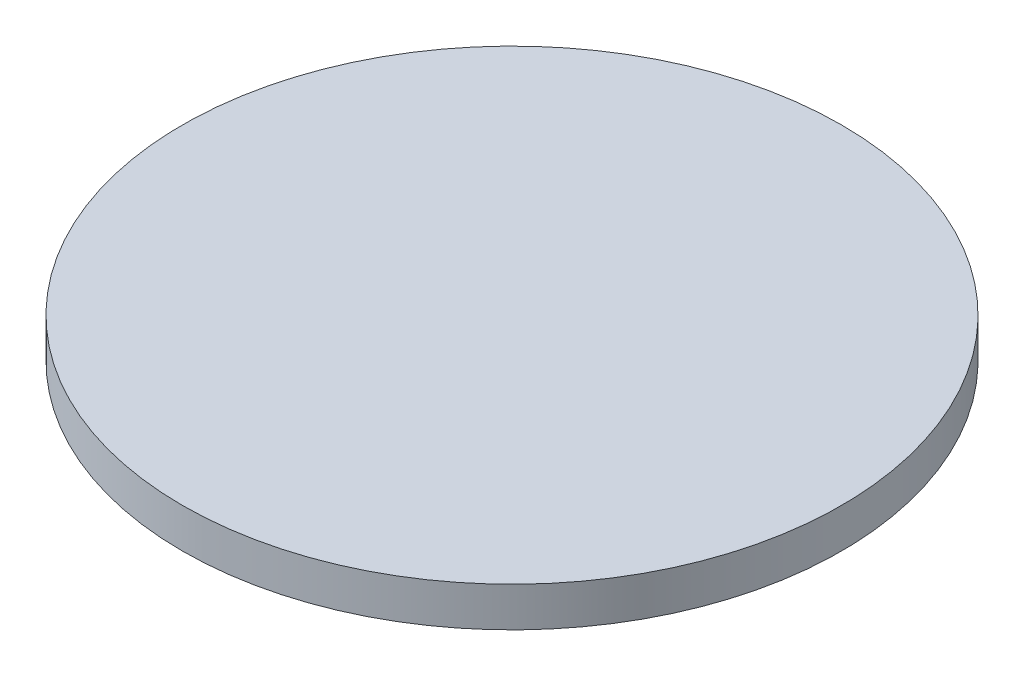
ISO-10303-21;
HEADER;
FILE_DESCRIPTION(('STEP AP214'),'2;1');
FILE_NAME('part.step','',(''),(''),'','','');
FILE_SCHEMA(('AUTOMOTIVE_DESIGN { 1 0 10303 214 1 1 1 1 }'));
ENDSEC;
DATA;
#1=APPLICATION_CONTEXT('core data for automotive mechanical design processes');
#2=APPLICATION_PROTOCOL_DEFINITION('international standard','automotive_design',2000,#1);
#3=PRODUCT_CONTEXT('',#1,'mechanical');
#4=PRODUCT('Part','Part','',(#3));
#5=PRODUCT_RELATED_PRODUCT_CATEGORY('part','',(#4));
#6=PRODUCT_DEFINITION_FORMATION('','',#4);
#7=PRODUCT_DEFINITION_CONTEXT('part definition',#1,'design');
#8=PRODUCT_DEFINITION('design','',#6,#7);
#9=PRODUCT_DEFINITION_SHAPE('','',#8);
#10=(LENGTH_UNIT() NAMED_UNIT(*) SI_UNIT(.MILLI.,.METRE.));
#11=(NAMED_UNIT(*) PLANE_ANGLE_UNIT() SI_UNIT($,.RADIAN.));
#12=(NAMED_UNIT(*) SI_UNIT($,.STERADIAN.) SOLID_ANGLE_UNIT());
#13=UNCERTAINTY_MEASURE_WITH_UNIT(LENGTH_MEASURE(1.E-05),#10,'distance_accuracy_value','');
#14=(GEOMETRIC_REPRESENTATION_CONTEXT(3) GLOBAL_UNCERTAINTY_ASSIGNED_CONTEXT((#13)) GLOBAL_UNIT_ASSIGNED_CONTEXT((#10,
#11,#12)) REPRESENTATION_CONTEXT('',''));
#15=CARTESIAN_POINT('',(0.,0.,0.));
#16=DIRECTION('',(0.,0.,1.));
#17=DIRECTION('',(1.,0.,0.));
#18=AXIS2_PLACEMENT_3D('',#15,#16,#17);
#19=CARTESIAN_POINT('',(0.,3.,0.));
#20=DIRECTION('',(0.,-1.,0.));
#21=DIRECTION('',(0.,0.,-1.));
#22=AXIS2_PLACEMENT_3D('',#19,#20,#21);
#23=CYLINDRICAL_SURFACE('',#22,25.);
#24=CARTESIAN_POINT('',(0.,3.,0.));
#25=DIRECTION('',(0.,1.,0.));
#26=DIRECTION('',(0.,0.,1.));
#27=AXIS2_PLACEMENT_3D('',#24,#25,#26);
#28=CIRCLE('',#27,25.);
#29=CARTESIAN_POINT('',(0.,3.,25.));
#30=VERTEX_POINT('',#29);
#31=EDGE_CURVE('E10',#30,#30,#28,.T.);
#32=ORIENTED_EDGE('',*,*,#31,.F.);
#33=EDGE_LOOP('',(#32));
#34=FACE_BOUND('',#33,.T.);
#35=CARTESIAN_POINT('',(0.,0.,0.));
#36=DIRECTION('',(0.,1.,0.));
#37=DIRECTION('',(0.,0.,1.));
#38=AXIS2_PLACEMENT_3D('',#35,#36,#37);
#39=CIRCLE('',#38,25.);
#40=CARTESIAN_POINT('',(0.,0.,25.));
#41=VERTEX_POINT('',#40);
#42=EDGE_CURVE('E34',#41,#41,#39,.T.);
#43=ORIENTED_EDGE('',*,*,#42,.T.);
#44=EDGE_LOOP('',(#43));
#45=FACE_BOUND('',#44,.T.);
#46=ADVANCED_FACE('F31',(#34,#45),#23,.T.);
#47=CARTESIAN_POINT('',(0.,3.,0.));
#48=DIRECTION('',(0.,1.,0.));
#49=DIRECTION('',(0.,0.,1.));
#50=AXIS2_PLACEMENT_3D('',#47,#48,#49);
#51=PLANE('',#50);
#52=ORIENTED_EDGE('',*,*,#31,.T.);
#53=EDGE_LOOP('',(#52));
#54=FACE_BOUND('',#53,.T.);
#55=ADVANCED_FACE('F46',(#54),#51,.T.);
#56=CARTESIAN_POINT('',(0.,0.,0.));
#57=DIRECTION('',(0.,1.,0.));
#58=DIRECTION('',(0.,0.,1.));
#59=AXIS2_PLACEMENT_3D('',#56,#57,#58);
#60=PLANE('',#59);
#61=ORIENTED_EDGE('',*,*,#42,.F.);
#62=EDGE_LOOP('',(#61));
#63=FACE_BOUND('',#62,.T.);
#64=ADVANCED_FACE('F44',(#63),#60,.F.);
#65=CLOSED_SHELL('',(#46,#55,#64));
#66=MANIFOLD_SOLID_BREP('B2',#65);
#67=ADVANCED_BREP_SHAPE_REPRESENTATION('',(#18,#66),#14);
#68=SHAPE_DEFINITION_REPRESENTATION(#9,#67);
ENDSEC;
END-ISO-10303-21;
